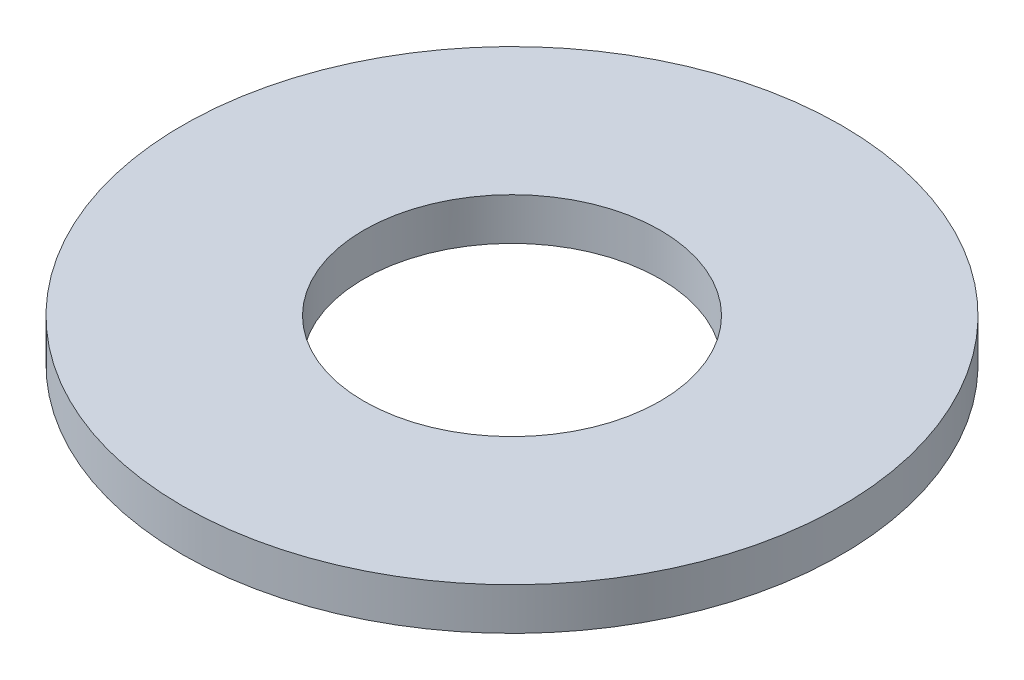
ISO-10303-21;
HEADER;
FILE_DESCRIPTION(('STEP AP214'),'2;1');
FILE_NAME('part.step','',(''),(''),'','','');
FILE_SCHEMA(('AUTOMOTIVE_DESIGN { 1 0 10303 214 1 1 1 1 }'));
ENDSEC;
DATA;
#1=APPLICATION_CONTEXT('core data for automotive mechanical design processes');
#2=APPLICATION_PROTOCOL_DEFINITION('international standard','automotive_design',2000,#1);
#3=PRODUCT_CONTEXT('',#1,'mechanical');
#4=PRODUCT('Part','Part','',(#3));
#5=PRODUCT_RELATED_PRODUCT_CATEGORY('part','',(#4));
#6=PRODUCT_DEFINITION_FORMATION('','',#4);
#7=PRODUCT_DEFINITION_CONTEXT('part definition',#1,'design');
#8=PRODUCT_DEFINITION('design','',#6,#7);
#9=PRODUCT_DEFINITION_SHAPE('','',#8);
#10=(LENGTH_UNIT() NAMED_UNIT(*) SI_UNIT(.MILLI.,.METRE.));
#11=(NAMED_UNIT(*) PLANE_ANGLE_UNIT() SI_UNIT($,.RADIAN.));
#12=(NAMED_UNIT(*) SI_UNIT($,.STERADIAN.) SOLID_ANGLE_UNIT());
#13=UNCERTAINTY_MEASURE_WITH_UNIT(LENGTH_MEASURE(1.E-05),#10,'distance_accuracy_value','');
#14=(GEOMETRIC_REPRESENTATION_CONTEXT(3) GLOBAL_UNCERTAINTY_ASSIGNED_CONTEXT((#13)) GLOBAL_UNIT_ASSIGNED_CONTEXT((#10,
#11,#12)) REPRESENTATION_CONTEXT('',''));
#15=CARTESIAN_POINT('',(0.,0.,0.));
#16=DIRECTION('',(0.,0.,1.));
#17=DIRECTION('',(1.,0.,0.));
#18=AXIS2_PLACEMENT_3D('',#15,#16,#17);
#19=CARTESIAN_POINT('',(0.,2.032,0.));
#20=DIRECTION('',(0.,-1.,0.));
#21=DIRECTION('',(0.,0.,-1.));
#22=AXIS2_PLACEMENT_3D('',#19,#20,#21);
#23=CYLINDRICAL_SURFACE('',#22,15.875);
#24=CARTESIAN_POINT('',(0.,2.032,0.));
#25=DIRECTION('',(0.,1.,0.));
#26=DIRECTION('',(0.,0.,1.));
#27=AXIS2_PLACEMENT_3D('',#24,#25,#26);
#28=CIRCLE('',#27,15.875);
#29=CARTESIAN_POINT('',(0.,2.032,15.875));
#30=VERTEX_POINT('',#29);
#31=EDGE_CURVE('E10',#30,#30,#28,.T.);
#32=ORIENTED_EDGE('',*,*,#31,.F.);
#33=EDGE_LOOP('',(#32));
#34=FACE_BOUND('',#33,.T.);
#35=CARTESIAN_POINT('',(0.,0.,0.));
#36=DIRECTION('',(0.,1.,0.));
#37=DIRECTION('',(0.,0.,1.));
#38=AXIS2_PLACEMENT_3D('',#35,#36,#37);
#39=CIRCLE('',#38,15.875);
#40=CARTESIAN_POINT('',(0.,0.,15.875));
#41=VERTEX_POINT('',#40);
#42=EDGE_CURVE('E40',#41,#41,#39,.T.);
#43=ORIENTED_EDGE('',*,*,#42,.T.);
#44=EDGE_LOOP('',(#43));
#45=FACE_BOUND('',#44,.T.);
#46=ADVANCED_FACE('F37',(#34,#45),#23,.T.);
#47=CARTESIAN_POINT('',(0.,2.032,0.));
#48=DIRECTION('',(0.,1.,0.));
#49=DIRECTION('',(0.,0.,1.));
#50=AXIS2_PLACEMENT_3D('',#47,#48,#49);
#51=PLANE('',#50);
#52=CARTESIAN_POINT('',(0.,2.032,0.));
#53=DIRECTION('',(0.,1.,0.));
#54=DIRECTION('',(0.,0.,1.));
#55=AXIS2_PLACEMENT_3D('',#52,#53,#54);
#56=CIRCLE('',#55,7.1374);
#57=CARTESIAN_POINT('',(0.,2.032,7.1374));
#58=VERTEX_POINT('',#57);
#59=EDGE_CURVE('E49',#58,#58,#56,.T.);
#60=ORIENTED_EDGE('',*,*,#59,.F.);
#61=EDGE_LOOP('',(#60));
#62=FACE_BOUND('',#61,.T.);
#63=ORIENTED_EDGE('',*,*,#31,.T.);
#64=EDGE_LOOP('',(#63));
#65=FACE_BOUND('',#64,.T.);
#66=ADVANCED_FACE('F64',(#62,#65),#51,.T.);
#67=CARTESIAN_POINT('',(0.,0.,0.));
#68=DIRECTION('',(0.,1.,0.));
#69=DIRECTION('',(0.,0.,1.));
#70=AXIS2_PLACEMENT_3D('',#67,#68,#69);
#71=PLANE('',#70);
#72=CARTESIAN_POINT('',(0.,0.,0.));
#73=DIRECTION('',(0.,-1.,0.));
#74=DIRECTION('',(0.,0.,-1.));
#75=AXIS2_PLACEMENT_3D('',#72,#73,#74);
#76=CIRCLE('',#75,7.1374);
#77=CARTESIAN_POINT('',(0.,0.,-7.1374));
#78=VERTEX_POINT('',#77);
#79=EDGE_CURVE('E54',#78,#78,#76,.T.);
#80=ORIENTED_EDGE('',*,*,#79,.F.);
#81=EDGE_LOOP('',(#80));
#82=FACE_BOUND('',#81,.T.);
#83=ORIENTED_EDGE('',*,*,#42,.F.);
#84=EDGE_LOOP('',(#83));
#85=FACE_BOUND('',#84,.T.);
#86=ADVANCED_FACE('F61',(#82,#85),#71,.F.);
#87=CARTESIAN_POINT('',(0.,3.302,0.));
#88=DIRECTION('',(0.,-1.,0.));
#89=DIRECTION('',(0.,0.,-1.));
#90=AXIS2_PLACEMENT_3D('',#87,#88,#89);
#91=CYLINDRICAL_SURFACE('',#90,7.1374);
#92=ORIENTED_EDGE('',*,*,#59,.T.);
#93=EDGE_LOOP('',(#92));
#94=FACE_BOUND('',#93,.T.);
#95=ORIENTED_EDGE('',*,*,#79,.T.);
#96=EDGE_LOOP('',(#95));
#97=FACE_BOUND('',#96,.T.);
#98=ADVANCED_FACE('F59',(#94,#97),#91,.F.);
#99=CLOSED_SHELL('',(#46,#66,#86,#98));
#100=MANIFOLD_SOLID_BREP('B2',#99);
#101=ADVANCED_BREP_SHAPE_REPRESENTATION('',(#18,#100),#14);
#102=SHAPE_DEFINITION_REPRESENTATION(#9,#101);
ENDSEC;
END-ISO-10303-21;
